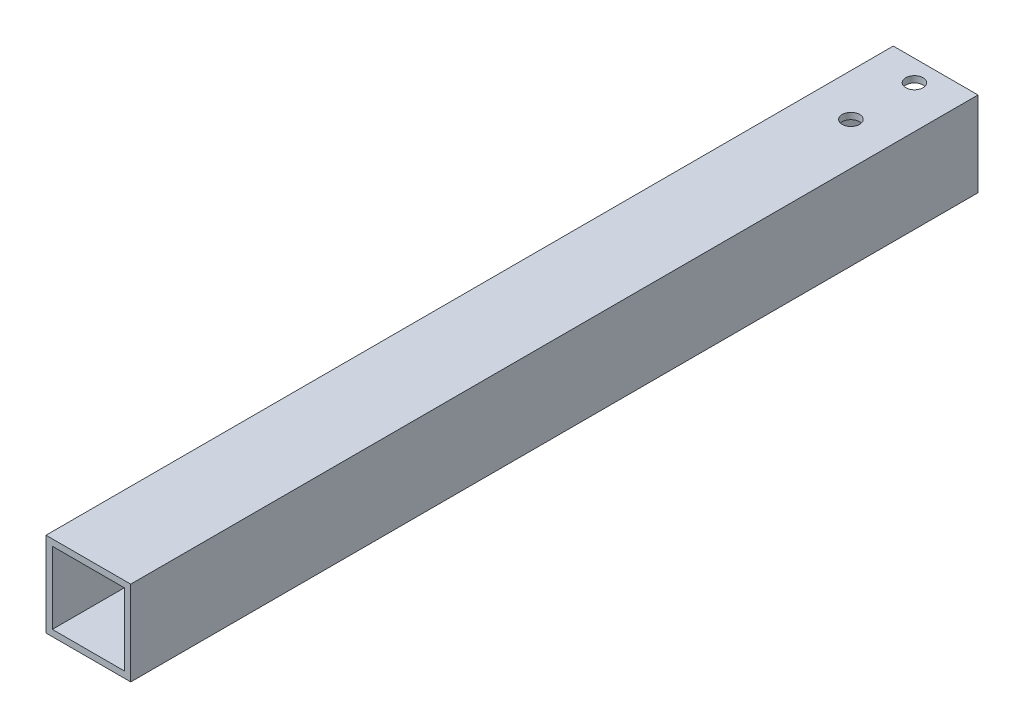
ISO-10303-21;
HEADER;
FILE_DESCRIPTION(('STEP AP214'),'2;1');
FILE_NAME('part.step','',(''),(''),'','','');
FILE_SCHEMA(('AUTOMOTIVE_DESIGN { 1 0 10303 214 1 1 1 1 }'));
ENDSEC;
DATA;
#1=APPLICATION_CONTEXT('core data for automotive mechanical design processes');
#2=APPLICATION_PROTOCOL_DEFINITION('international standard','automotive_design',2000,#1);
#3=PRODUCT_CONTEXT('',#1,'mechanical');
#4=PRODUCT('Part','Part','',(#3));
#5=PRODUCT_RELATED_PRODUCT_CATEGORY('part','',(#4));
#6=PRODUCT_DEFINITION_FORMATION('','',#4);
#7=PRODUCT_DEFINITION_CONTEXT('part definition',#1,'design');
#8=PRODUCT_DEFINITION('design','',#6,#7);
#9=PRODUCT_DEFINITION_SHAPE('','',#8);
#10=(LENGTH_UNIT() NAMED_UNIT(*) SI_UNIT(.MILLI.,.METRE.));
#11=(NAMED_UNIT(*) PLANE_ANGLE_UNIT() SI_UNIT($,.RADIAN.));
#12=(NAMED_UNIT(*) SI_UNIT($,.STERADIAN.) SOLID_ANGLE_UNIT());
#13=UNCERTAINTY_MEASURE_WITH_UNIT(LENGTH_MEASURE(1.E-05),#10,'distance_accuracy_value','');
#14=(GEOMETRIC_REPRESENTATION_CONTEXT(3) GLOBAL_UNCERTAINTY_ASSIGNED_CONTEXT((#13)) GLOBAL_UNIT_ASSIGNED_CONTEXT((#10,
#11,#12)) REPRESENTATION_CONTEXT('',''));
#15=CARTESIAN_POINT('',(0.,0.,0.));
#16=DIRECTION('',(0.,0.,1.));
#17=DIRECTION('',(1.,0.,0.));
#18=AXIS2_PLACEMENT_3D('',#15,#16,#17);
#19=CARTESIAN_POINT('',(0.,0.,200.));
#20=DIRECTION('',(0.,0.,1.));
#21=DIRECTION('',(1.,0.,0.));
#22=AXIS2_PLACEMENT_3D('',#19,#20,#21);
#23=PLANE('',#22);
#24=DIRECTION('',(0.,1.,0.));
#25=VECTOR('',#24,1.);
#26=CARTESIAN_POINT('',(10.,10.,200.));
#27=LINE('',#26,#25);
#28=CARTESIAN_POINT('',(10.,-10.,200.));
#29=VERTEX_POINT('',#28);
#30=CARTESIAN_POINT('',(10.,10.,200.));
#31=VERTEX_POINT('',#30);
#32=EDGE_CURVE('E150',#29,#31,#27,.T.);
#33=ORIENTED_EDGE('',*,*,#32,.T.);
#34=DIRECTION('',(-1.,0.,0.));
#35=VECTOR('',#34,1.);
#36=CARTESIAN_POINT('',(-10.,10.,200.));
#37=LINE('',#36,#35);
#38=CARTESIAN_POINT('',(-10.,10.,200.));
#39=VERTEX_POINT('',#38);
#40=EDGE_CURVE('E153',#31,#39,#37,.T.);
#41=ORIENTED_EDGE('',*,*,#40,.T.);
#42=DIRECTION('',(0.,-1.,0.));
#43=VECTOR('',#42,1.);
#44=CARTESIAN_POINT('',(-10.,10.,200.));
#45=LINE('',#44,#43);
#46=CARTESIAN_POINT('',(-10.,-10.,200.));
#47=VERTEX_POINT('',#46);
#48=EDGE_CURVE('E156',#39,#47,#45,.T.);
#49=ORIENTED_EDGE('',*,*,#48,.T.);
#50=DIRECTION('',(1.,0.,0.));
#51=VECTOR('',#50,1.);
#52=CARTESIAN_POINT('',(-10.,-10.,200.));
#53=LINE('',#52,#51);
#54=EDGE_CURVE('E158',#47,#29,#53,.T.);
#55=ORIENTED_EDGE('',*,*,#54,.T.);
#56=EDGE_LOOP('',(#33,#41,#49,#55));
#57=FACE_BOUND('',#56,.T.);
#58=DIRECTION('',(-1.,0.,0.));
#59=VECTOR('',#58,1.);
#60=CARTESIAN_POINT('',(-8.5,8.5,200.));
#61=LINE('',#60,#59);
#62=CARTESIAN_POINT('',(8.5,8.5,200.));
#63=VERTEX_POINT('',#62);
#64=CARTESIAN_POINT('',(-8.5,8.5,200.));
#65=VERTEX_POINT('',#64);
#66=EDGE_CURVE('E120',#63,#65,#61,.T.);
#67=ORIENTED_EDGE('',*,*,#66,.F.);
#68=DIRECTION('',(0.,1.,0.));
#69=VECTOR('',#68,1.);
#70=CARTESIAN_POINT('',(8.5,8.5,200.));
#71=LINE('',#70,#69);
#72=CARTESIAN_POINT('',(8.5,-8.5,200.));
#73=VERTEX_POINT('',#72);
#74=EDGE_CURVE('E112',#73,#63,#71,.T.);
#75=ORIENTED_EDGE('',*,*,#74,.F.);
#76=DIRECTION('',(1.,0.,0.));
#77=VECTOR('',#76,1.);
#78=CARTESIAN_POINT('',(-8.5,-8.5,200.));
#79=LINE('',#78,#77);
#80=CARTESIAN_POINT('',(-8.5,-8.5,200.));
#81=VERTEX_POINT('',#80);
#82=EDGE_CURVE('E134',#81,#73,#79,.T.);
#83=ORIENTED_EDGE('',*,*,#82,.F.);
#84=DIRECTION('',(0.,-1.,0.));
#85=VECTOR('',#84,1.);
#86=CARTESIAN_POINT('',(-8.5,8.5,200.));
#87=LINE('',#86,#85);
#88=EDGE_CURVE('E132',#65,#81,#87,.T.);
#89=ORIENTED_EDGE('',*,*,#88,.F.);
#90=EDGE_LOOP('',(#67,#75,#83,#89));
#91=FACE_BOUND('',#90,.T.);
#92=ADVANCED_FACE('F45',(#57,#91),#23,.T.);
#93=CARTESIAN_POINT('',(0.,0.,0.));
#94=DIRECTION('',(0.,0.,1.));
#95=DIRECTION('',(1.,0.,0.));
#96=AXIS2_PLACEMENT_3D('',#93,#94,#95);
#97=PLANE('',#96);
#98=DIRECTION('',(0.,1.,0.));
#99=VECTOR('',#98,1.);
#100=CARTESIAN_POINT('',(10.,10.,0.));
#101=LINE('',#100,#99);
#102=CARTESIAN_POINT('',(10.,-10.,0.));
#103=VERTEX_POINT('',#102);
#104=CARTESIAN_POINT('',(10.,10.,0.));
#105=VERTEX_POINT('',#104);
#106=EDGE_CURVE('E128',#103,#105,#101,.T.);
#107=ORIENTED_EDGE('',*,*,#106,.F.);
#108=DIRECTION('',(1.,0.,0.));
#109=VECTOR('',#108,1.);
#110=CARTESIAN_POINT('',(-10.,-10.,0.));
#111=LINE('',#110,#109);
#112=CARTESIAN_POINT('',(-10.,-10.,0.));
#113=VERTEX_POINT('',#112);
#114=EDGE_CURVE('E154',#113,#103,#111,.T.);
#115=ORIENTED_EDGE('',*,*,#114,.F.);
#116=DIRECTION('',(0.,-1.,0.));
#117=VECTOR('',#116,1.);
#118=CARTESIAN_POINT('',(-10.,10.,0.));
#119=LINE('',#118,#117);
#120=CARTESIAN_POINT('',(-10.,10.,0.));
#121=VERTEX_POINT('',#120);
#122=EDGE_CURVE('E165',#121,#113,#119,.T.);
#123=ORIENTED_EDGE('',*,*,#122,.F.);
#124=DIRECTION('',(-1.,0.,0.));
#125=VECTOR('',#124,1.);
#126=CARTESIAN_POINT('',(-10.,10.,0.));
#127=LINE('',#126,#125);
#128=EDGE_CURVE('E163',#105,#121,#127,.T.);
#129=ORIENTED_EDGE('',*,*,#128,.F.);
#130=EDGE_LOOP('',(#107,#115,#123,#129));
#131=FACE_BOUND('',#130,.T.);
#132=DIRECTION('',(0.,1.,0.));
#133=VECTOR('',#132,1.);
#134=CARTESIAN_POINT('',(8.5,8.5,0.));
#135=LINE('',#134,#133);
#136=CARTESIAN_POINT('',(8.5,-8.5,0.));
#137=VERTEX_POINT('',#136);
#138=CARTESIAN_POINT('',(8.5,8.5,0.));
#139=VERTEX_POINT('',#138);
#140=EDGE_CURVE('E70',#137,#139,#135,.T.);
#141=ORIENTED_EDGE('',*,*,#140,.T.);
#142=DIRECTION('',(-1.,0.,0.));
#143=VECTOR('',#142,1.);
#144=CARTESIAN_POINT('',(-8.5,8.5,0.));
#145=LINE('',#144,#143);
#146=CARTESIAN_POINT('',(-8.5,8.5,0.));
#147=VERTEX_POINT('',#146);
#148=EDGE_CURVE('E127',#139,#147,#145,.T.);
#149=ORIENTED_EDGE('',*,*,#148,.T.);
#150=DIRECTION('',(0.,-1.,0.));
#151=VECTOR('',#150,1.);
#152=CARTESIAN_POINT('',(-8.5,8.5,0.));
#153=LINE('',#152,#151);
#154=CARTESIAN_POINT('',(-8.5,-8.5,0.));
#155=VERTEX_POINT('',#154);
#156=EDGE_CURVE('E142',#147,#155,#153,.T.);
#157=ORIENTED_EDGE('',*,*,#156,.T.);
#158=DIRECTION('',(1.,0.,0.));
#159=VECTOR('',#158,1.);
#160=CARTESIAN_POINT('',(-8.5,-8.5,0.));
#161=LINE('',#160,#159);
#162=EDGE_CURVE('E121',#155,#137,#161,.T.);
#163=ORIENTED_EDGE('',*,*,#162,.T.);
#164=EDGE_LOOP('',(#141,#149,#157,#163));
#165=FACE_BOUND('',#164,.T.);
#166=ADVANCED_FACE('F213',(#131,#165),#97,.F.);
#167=CARTESIAN_POINT('',(10.,10.,200.));
#168=DIRECTION('',(-1.,0.,0.));
#169=DIRECTION('',(0.,0.,1.));
#170=AXIS2_PLACEMENT_3D('',#167,#168,#169);
#171=PLANE('',#170);
#172=ORIENTED_EDGE('',*,*,#106,.T.);
#173=DIRECTION('',(0.,0.,-1.));
#174=VECTOR('',#173,1.);
#175=CARTESIAN_POINT('',(10.,10.,200.));
#176=LINE('',#175,#174);
#177=EDGE_CURVE('E13',#31,#105,#176,.T.);
#178=ORIENTED_EDGE('',*,*,#177,.F.);
#179=ORIENTED_EDGE('',*,*,#32,.F.);
#180=DIRECTION('',(0.,0.,-1.));
#181=VECTOR('',#180,1.);
#182=CARTESIAN_POINT('',(10.,-10.,200.));
#183=LINE('',#182,#181);
#184=EDGE_CURVE('E160',#29,#103,#183,.T.);
#185=ORIENTED_EDGE('',*,*,#184,.T.);
#186=EDGE_LOOP('',(#172,#178,#179,#185));
#187=FACE_BOUND('',#186,.T.);
#188=ADVANCED_FACE('F47',(#187),#171,.F.);
#189=CARTESIAN_POINT('',(-10.,10.,200.));
#190=DIRECTION('',(0.,-1.,0.));
#191=DIRECTION('',(0.,0.,-1.));
#192=AXIS2_PLACEMENT_3D('',#189,#190,#191);
#193=PLANE('',#192);
#194=CARTESIAN_POINT('',(0.,10.,20.));
#195=DIRECTION('',(0.,1.,0.));
#196=DIRECTION('',(0.,0.,1.));
#197=AXIS2_PLACEMENT_3D('',#194,#195,#196);
#198=CIRCLE('',#197,2.05);
#199=CARTESIAN_POINT('',(0.,10.,22.05));
#200=VERTEX_POINT('',#199);
#201=EDGE_CURVE('E240',#200,#200,#198,.T.);
#202=ORIENTED_EDGE('',*,*,#201,.F.);
#203=EDGE_LOOP('',(#202));
#204=FACE_BOUND('',#203,.T.);
#205=CARTESIAN_POINT('',(0.,10.,5.));
#206=DIRECTION('',(0.,1.,0.));
#207=DIRECTION('',(0.,0.,1.));
#208=AXIS2_PLACEMENT_3D('',#205,#206,#207);
#209=CIRCLE('',#208,2.05);
#210=CARTESIAN_POINT('',(0.,10.,7.05));
#211=VERTEX_POINT('',#210);
#212=EDGE_CURVE('E177',#211,#211,#209,.T.);
#213=ORIENTED_EDGE('',*,*,#212,.F.);
#214=EDGE_LOOP('',(#213));
#215=FACE_BOUND('',#214,.T.);
#216=ORIENTED_EDGE('',*,*,#128,.T.);
#217=DIRECTION('',(0.,0.,-1.));
#218=VECTOR('',#217,1.);
#219=CARTESIAN_POINT('',(-10.,10.,200.));
#220=LINE('',#219,#218);
#221=EDGE_CURVE('E54',#39,#121,#220,.T.);
#222=ORIENTED_EDGE('',*,*,#221,.F.);
#223=ORIENTED_EDGE('',*,*,#40,.F.);
#224=ORIENTED_EDGE('',*,*,#177,.T.);
#225=EDGE_LOOP('',(#216,#222,#223,#224));
#226=FACE_BOUND('',#225,.T.);
#227=ADVANCED_FACE('F229',(#204,#215,#226),#193,.F.);
#228=CARTESIAN_POINT('',(-10.,10.,200.));
#229=DIRECTION('',(1.,0.,0.));
#230=DIRECTION('',(0.,1.,0.));
#231=AXIS2_PLACEMENT_3D('',#228,#229,#230);
#232=PLANE('',#231);
#233=ORIENTED_EDGE('',*,*,#122,.T.);
#234=DIRECTION('',(0.,0.,-1.));
#235=VECTOR('',#234,1.);
#236=CARTESIAN_POINT('',(-10.,-10.,200.));
#237=LINE('',#236,#235);
#238=EDGE_CURVE('E170',#47,#113,#237,.T.);
#239=ORIENTED_EDGE('',*,*,#238,.F.);
#240=ORIENTED_EDGE('',*,*,#48,.F.);
#241=ORIENTED_EDGE('',*,*,#221,.T.);
#242=EDGE_LOOP('',(#233,#239,#240,#241));
#243=FACE_BOUND('',#242,.T.);
#244=ADVANCED_FACE('F226',(#243),#232,.F.);
#245=CARTESIAN_POINT('',(-10.,-10.,200.));
#246=DIRECTION('',(0.,1.,0.));
#247=DIRECTION('',(0.,0.,1.));
#248=AXIS2_PLACEMENT_3D('',#245,#246,#247);
#249=PLANE('',#248);
#250=CARTESIAN_POINT('',(0.,-10.,20.));
#251=DIRECTION('',(0.,1.,0.));
#252=DIRECTION('',(0.,0.,1.));
#253=AXIS2_PLACEMENT_3D('',#250,#251,#252);
#254=CIRCLE('',#253,2.05);
#255=CARTESIAN_POINT('',(0.,-10.,22.05));
#256=VERTEX_POINT('',#255);
#257=EDGE_CURVE('E183',#256,#256,#254,.T.);
#258=ORIENTED_EDGE('',*,*,#257,.T.);
#259=EDGE_LOOP('',(#258));
#260=FACE_BOUND('',#259,.T.);
#261=CARTESIAN_POINT('',(0.,-10.,5.));
#262=DIRECTION('',(0.,1.,0.));
#263=DIRECTION('',(0.,0.,1.));
#264=AXIS2_PLACEMENT_3D('',#261,#262,#263);
#265=CIRCLE('',#264,2.05);
#266=CARTESIAN_POINT('',(0.,-10.,7.05));
#267=VERTEX_POINT('',#266);
#268=EDGE_CURVE('E140',#267,#267,#265,.T.);
#269=ORIENTED_EDGE('',*,*,#268,.T.);
#270=EDGE_LOOP('',(#269));
#271=FACE_BOUND('',#270,.T.);
#272=ORIENTED_EDGE('',*,*,#114,.T.);
#273=ORIENTED_EDGE('',*,*,#184,.F.);
#274=ORIENTED_EDGE('',*,*,#54,.F.);
#275=ORIENTED_EDGE('',*,*,#238,.T.);
#276=EDGE_LOOP('',(#272,#273,#274,#275));
#277=FACE_BOUND('',#276,.T.);
#278=ADVANCED_FACE('F194',(#260,#271,#277),#249,.F.);
#279=CARTESIAN_POINT('',(8.5,8.5,200.));
#280=DIRECTION('',(-1.,0.,0.));
#281=DIRECTION('',(0.,0.,1.));
#282=AXIS2_PLACEMENT_3D('',#279,#280,#281);
#283=PLANE('',#282);
#284=ORIENTED_EDGE('',*,*,#140,.F.);
#285=DIRECTION('',(0.,0.,-1.));
#286=VECTOR('',#285,1.);
#287=CARTESIAN_POINT('',(8.5,-8.5,200.));
#288=LINE('',#287,#286);
#289=EDGE_CURVE('E116',#73,#137,#288,.T.);
#290=ORIENTED_EDGE('',*,*,#289,.F.);
#291=ORIENTED_EDGE('',*,*,#74,.T.);
#292=DIRECTION('',(0.,0.,-1.));
#293=VECTOR('',#292,1.);
#294=CARTESIAN_POINT('',(8.5,8.5,200.));
#295=LINE('',#294,#293);
#296=EDGE_CURVE('E115',#63,#139,#295,.T.);
#297=ORIENTED_EDGE('',*,*,#296,.T.);
#298=EDGE_LOOP('',(#284,#290,#291,#297));
#299=FACE_BOUND('',#298,.T.);
#300=ADVANCED_FACE('F114',(#299),#283,.T.);
#301=CARTESIAN_POINT('',(-8.5,8.5,200.));
#302=DIRECTION('',(0.,-1.,0.));
#303=DIRECTION('',(0.,0.,-1.));
#304=AXIS2_PLACEMENT_3D('',#301,#302,#303);
#305=PLANE('',#304);
#306=CARTESIAN_POINT('',(0.,8.5,20.));
#307=DIRECTION('',(0.,-1.,0.));
#308=DIRECTION('',(0.,0.,-1.));
#309=AXIS2_PLACEMENT_3D('',#306,#307,#308);
#310=CIRCLE('',#309,2.05);
#311=CARTESIAN_POINT('',(0.,8.5,17.95));
#312=VERTEX_POINT('',#311);
#313=EDGE_CURVE('E188',#312,#312,#310,.T.);
#314=ORIENTED_EDGE('',*,*,#313,.F.);
#315=EDGE_LOOP('',(#314));
#316=FACE_BOUND('',#315,.T.);
#317=CARTESIAN_POINT('',(0.,8.5,5.));
#318=DIRECTION('',(0.,-1.,0.));
#319=DIRECTION('',(0.,0.,-1.));
#320=AXIS2_PLACEMENT_3D('',#317,#318,#319);
#321=CIRCLE('',#320,2.05);
#322=CARTESIAN_POINT('',(0.,8.5,2.95));
#323=VERTEX_POINT('',#322);
#324=EDGE_CURVE('E176',#323,#323,#321,.T.);
#325=ORIENTED_EDGE('',*,*,#324,.F.);
#326=EDGE_LOOP('',(#325));
#327=FACE_BOUND('',#326,.T.);
#328=ORIENTED_EDGE('',*,*,#148,.F.);
#329=ORIENTED_EDGE('',*,*,#296,.F.);
#330=ORIENTED_EDGE('',*,*,#66,.T.);
#331=DIRECTION('',(0.,0.,-1.));
#332=VECTOR('',#331,1.);
#333=CARTESIAN_POINT('',(-8.5,8.5,200.));
#334=LINE('',#333,#332);
#335=EDGE_CURVE('E129',#65,#147,#334,.T.);
#336=ORIENTED_EDGE('',*,*,#335,.T.);
#337=EDGE_LOOP('',(#328,#329,#330,#336));
#338=FACE_BOUND('',#337,.T.);
#339=ADVANCED_FACE('F124',(#316,#327,#338),#305,.T.);
#340=CARTESIAN_POINT('',(-8.5,8.5,200.));
#341=DIRECTION('',(1.,0.,0.));
#342=DIRECTION('',(0.,0.,-1.));
#343=AXIS2_PLACEMENT_3D('',#340,#341,#342);
#344=PLANE('',#343);
#345=ORIENTED_EDGE('',*,*,#156,.F.);
#346=ORIENTED_EDGE('',*,*,#335,.F.);
#347=ORIENTED_EDGE('',*,*,#88,.T.);
#348=DIRECTION('',(0.,0.,-1.));
#349=VECTOR('',#348,1.);
#350=CARTESIAN_POINT('',(-8.5,-8.5,200.));
#351=LINE('',#350,#349);
#352=EDGE_CURVE('E62',#81,#155,#351,.T.);
#353=ORIENTED_EDGE('',*,*,#352,.T.);
#354=EDGE_LOOP('',(#345,#346,#347,#353));
#355=FACE_BOUND('',#354,.T.);
#356=ADVANCED_FACE('F208',(#355),#344,.T.);
#357=CARTESIAN_POINT('',(-8.5,-8.5,200.));
#358=DIRECTION('',(0.,1.,0.));
#359=DIRECTION('',(0.,0.,1.));
#360=AXIS2_PLACEMENT_3D('',#357,#358,#359);
#361=PLANE('',#360);
#362=CARTESIAN_POINT('',(0.,-8.5,20.));
#363=DIRECTION('',(0.,1.,0.));
#364=DIRECTION('',(0.,0.,1.));
#365=AXIS2_PLACEMENT_3D('',#362,#363,#364);
#366=CIRCLE('',#365,2.05);
#367=CARTESIAN_POINT('',(0.,-8.5,22.05));
#368=VERTEX_POINT('',#367);
#369=EDGE_CURVE('E49',#368,#368,#366,.T.);
#370=ORIENTED_EDGE('',*,*,#369,.F.);
#371=EDGE_LOOP('',(#370));
#372=FACE_BOUND('',#371,.T.);
#373=CARTESIAN_POINT('',(0.,-8.5,5.));
#374=DIRECTION('',(0.,1.,0.));
#375=DIRECTION('',(0.,0.,1.));
#376=AXIS2_PLACEMENT_3D('',#373,#374,#375);
#377=CIRCLE('',#376,2.05);
#378=CARTESIAN_POINT('',(0.,-8.5,7.05));
#379=VERTEX_POINT('',#378);
#380=EDGE_CURVE('E174',#379,#379,#377,.T.);
#381=ORIENTED_EDGE('',*,*,#380,.F.);
#382=EDGE_LOOP('',(#381));
#383=FACE_BOUND('',#382,.T.);
#384=ORIENTED_EDGE('',*,*,#162,.F.);
#385=ORIENTED_EDGE('',*,*,#352,.F.);
#386=ORIENTED_EDGE('',*,*,#82,.T.);
#387=ORIENTED_EDGE('',*,*,#289,.T.);
#388=EDGE_LOOP('',(#384,#385,#386,#387));
#389=FACE_BOUND('',#388,.T.);
#390=ADVANCED_FACE('F200',(#372,#383,#389),#361,.T.);
#391=CARTESIAN_POINT('',(0.,-14.,5.));
#392=DIRECTION('',(0.,1.,0.));
#393=DIRECTION('',(0.,0.,1.));
#394=AXIS2_PLACEMENT_3D('',#391,#392,#393);
#395=CYLINDRICAL_SURFACE('',#394,2.05);
#396=ORIENTED_EDGE('',*,*,#380,.T.);
#397=EDGE_LOOP('',(#396));
#398=FACE_BOUND('',#397,.T.);
#399=ORIENTED_EDGE('',*,*,#268,.F.);
#400=EDGE_LOOP('',(#399));
#401=FACE_BOUND('',#400,.T.);
#402=ADVANCED_FACE('F197',(#398,#401),#395,.F.);
#403=ORIENTED_EDGE('',*,*,#324,.T.);
#404=EDGE_LOOP('',(#403));
#405=FACE_BOUND('',#404,.T.);
#406=ORIENTED_EDGE('',*,*,#212,.T.);
#407=EDGE_LOOP('',(#406));
#408=FACE_BOUND('',#407,.T.);
#409=ADVANCED_FACE('F199',(#405,#408),#395,.F.);
#410=CARTESIAN_POINT('',(0.,-14.,20.));
#411=DIRECTION('',(0.,1.,0.));
#412=DIRECTION('',(0.,0.,1.));
#413=AXIS2_PLACEMENT_3D('',#410,#411,#412);
#414=CYLINDRICAL_SURFACE('',#413,2.05);
#415=ORIENTED_EDGE('',*,*,#369,.T.);
#416=EDGE_LOOP('',(#415));
#417=FACE_BOUND('',#416,.T.);
#418=ORIENTED_EDGE('',*,*,#257,.F.);
#419=EDGE_LOOP('',(#418));
#420=FACE_BOUND('',#419,.T.);
#421=ADVANCED_FACE('F206',(#417,#420),#414,.F.);
#422=ORIENTED_EDGE('',*,*,#313,.T.);
#423=EDGE_LOOP('',(#422));
#424=FACE_BOUND('',#423,.T.);
#425=ORIENTED_EDGE('',*,*,#201,.T.);
#426=EDGE_LOOP('',(#425));
#427=FACE_BOUND('',#426,.T.);
#428=ADVANCED_FACE('F272',(#424,#427),#414,.F.);
#429=CLOSED_SHELL('',(#92,#166,#188,#227,#244,#278,#300,#339,#356,#390,#402,#409,#421,#428));
#430=MANIFOLD_SOLID_BREP('B2',#429);
#431=ADVANCED_BREP_SHAPE_REPRESENTATION('',(#18,#430),#14);
#432=SHAPE_DEFINITION_REPRESENTATION(#9,#431);
ENDSEC;
END-ISO-10303-21;
